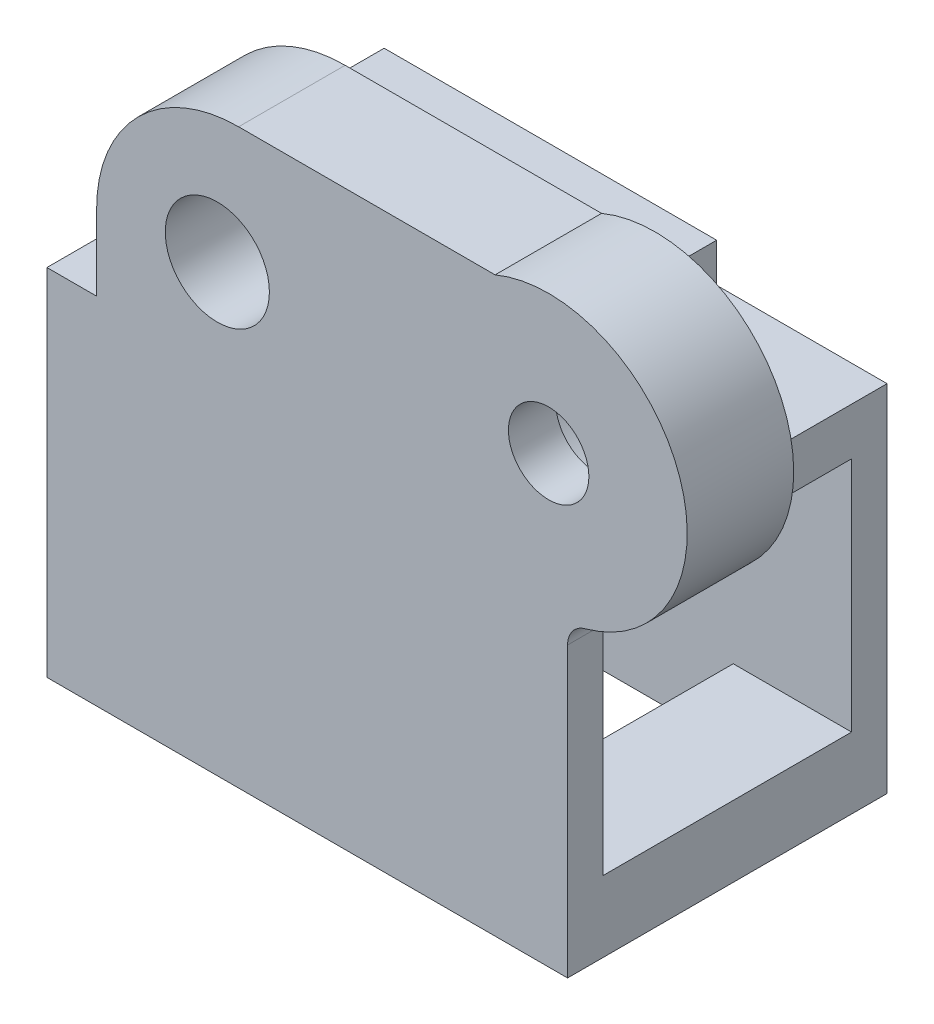
ISO-10303-21;
HEADER;
FILE_DESCRIPTION(('STEP AP214'),'2;1');
FILE_NAME('part.step','',(''),(''),'','','');
FILE_SCHEMA(('AUTOMOTIVE_DESIGN { 1 0 10303 214 1 1 1 1 }'));
ENDSEC;
DATA;
#1=APPLICATION_CONTEXT('core data for automotive mechanical design processes');
#2=APPLICATION_PROTOCOL_DEFINITION('international standard','automotive_design',2000,#1);
#3=PRODUCT_CONTEXT('',#1,'mechanical');
#4=PRODUCT('Part','Part','',(#3));
#5=PRODUCT_RELATED_PRODUCT_CATEGORY('part','',(#4));
#6=PRODUCT_DEFINITION_FORMATION('','',#4);
#7=PRODUCT_DEFINITION_CONTEXT('part definition',#1,'design');
#8=PRODUCT_DEFINITION('design','',#6,#7);
#9=PRODUCT_DEFINITION_SHAPE('','',#8);
#10=(LENGTH_UNIT() NAMED_UNIT(*) SI_UNIT(.MILLI.,.METRE.));
#11=(NAMED_UNIT(*) PLANE_ANGLE_UNIT() SI_UNIT($,.RADIAN.));
#12=(NAMED_UNIT(*) SI_UNIT($,.STERADIAN.) SOLID_ANGLE_UNIT());
#13=UNCERTAINTY_MEASURE_WITH_UNIT(LENGTH_MEASURE(1.E-05),#10,'distance_accuracy_value','');
#14=(GEOMETRIC_REPRESENTATION_CONTEXT(3) GLOBAL_UNCERTAINTY_ASSIGNED_CONTEXT((#13)) GLOBAL_UNIT_ASSIGNED_CONTEXT((#10,
#11,#12)) REPRESENTATION_CONTEXT('',''));
#15=CARTESIAN_POINT('',(0.,0.,0.));
#16=DIRECTION('',(0.,0.,1.));
#17=DIRECTION('',(1.,0.,0.));
#18=AXIS2_PLACEMENT_3D('',#15,#16,#17);
#19=CARTESIAN_POINT('',(0.,5.,0.));
#20=DIRECTION('',(0.,-1.,0.));
#21=DIRECTION('',(0.,0.,-1.));
#22=AXIS2_PLACEMENT_3D('',#19,#20,#21);
#23=PLANE('',#22);
#24=CARTESIAN_POINT('',(11.25,5.,-5.25));
#25=DIRECTION('',(0.,1.,0.));
#26=DIRECTION('',(0.,0.,1.));
#27=AXIS2_PLACEMENT_3D('',#24,#25,#26);
#28=CIRCLE('',#27,2.2);
#29=CARTESIAN_POINT('',(11.25,5.,-3.05));
#30=VERTEX_POINT('',#29);
#31=EDGE_CURVE('E262',#30,#30,#28,.T.);
#32=ORIENTED_EDGE('',*,*,#31,.F.);
#33=EDGE_LOOP('',(#32));
#34=FACE_BOUND('',#33,.T.);
#35=DIRECTION('',(0.,0.,1.));
#36=VECTOR('',#35,1.);
#37=CARTESIAN_POINT('',(2.6,5.,-10.65));
#38=LINE('',#37,#36);
#39=CARTESIAN_POINT('',(2.6,5.,-10.65));
#40=VERTEX_POINT('',#39);
#41=CARTESIAN_POINT('',(2.6,5.,-3.));
#42=VERTEX_POINT('',#41);
#43=EDGE_CURVE('E274',#40,#42,#38,.T.);
#44=ORIENTED_EDGE('',*,*,#43,.T.);
#45=DIRECTION('',(-1.,0.,0.));
#46=VECTOR('',#45,1.);
#47=CARTESIAN_POINT('',(0.,5.,-3.));
#48=LINE('',#47,#46);
#49=CARTESIAN_POINT('',(5.65060984680808,5.,-3.));
#50=VERTEX_POINT('',#49);
#51=EDGE_CURVE('E219',#50,#42,#48,.T.);
#52=ORIENTED_EDGE('',*,*,#51,.F.);
#53=DIRECTION('',(-1.,0.,0.));
#54=VECTOR('',#53,1.);
#55=CARTESIAN_POINT('',(0.,5.,-3.));
#56=LINE('',#55,#54);
#57=CARTESIAN_POINT('',(9.74939015319192,5.,-3.));
#58=VERTEX_POINT('',#57);
#59=EDGE_CURVE('E213',#58,#50,#56,.T.);
#60=ORIENTED_EDGE('',*,*,#59,.F.);
#61=CARTESIAN_POINT('',(16.65,5.,-3.));
#62=VERTEX_POINT('',#61);
#63=EDGE_CURVE('E217',#62,#58,#48,.T.);
#64=ORIENTED_EDGE('',*,*,#63,.F.);
#65=DIRECTION('',(0.,0.,-1.));
#66=VECTOR('',#65,1.);
#67=CARTESIAN_POINT('',(16.65,5.,0.15));
#68=LINE('',#67,#66);
#69=CARTESIAN_POINT('',(16.65,5.,-10.65));
#70=VERTEX_POINT('',#69);
#71=EDGE_CURVE('E267',#62,#70,#68,.T.);
#72=ORIENTED_EDGE('',*,*,#71,.T.);
#73=DIRECTION('',(-1.,0.,0.));
#74=VECTOR('',#73,1.);
#75=CARTESIAN_POINT('',(5.85,5.,-10.65));
#76=LINE('',#75,#74);
#77=EDGE_CURVE('E270',#70,#40,#76,.T.);
#78=ORIENTED_EDGE('',*,*,#77,.T.);
#79=EDGE_LOOP('',(#44,#52,#60,#64,#72,#78));
#80=FACE_BOUND('',#79,.T.);
#81=ADVANCED_FACE('F47',(#34,#80),#23,.F.);
#82=CARTESIAN_POINT('',(21.7,5.8,-3.));
#83=DIRECTION('',(0.,0.,1.));
#84=DIRECTION('',(1.,0.,0.));
#85=AXIS2_PLACEMENT_3D('',#82,#83,#84);
#86=CYLINDRICAL_SURFACE('',#85,5.85491246732178);
#87=CARTESIAN_POINT('',(21.7,5.8,-3.));
#88=DIRECTION('',(0.,0.,-1.));
#89=DIRECTION('',(-1.,0.,0.));
#90=AXIS2_PLACEMENT_3D('',#87,#88,#89);
#91=CIRCLE('',#90,5.85491246732178);
#92=CARTESIAN_POINT('',(19.4372583002031,11.2,-3.));
#93=VERTEX_POINT('',#92);
#94=CARTESIAN_POINT('',(22.5,0.,-3.));
#95=VERTEX_POINT('',#94);
#96=EDGE_CURVE('E345',#93,#95,#91,.T.);
#97=ORIENTED_EDGE('',*,*,#96,.F.);
#98=DIRECTION('',(0.,0.,1.));
#99=VECTOR('',#98,1.);
#100=CARTESIAN_POINT('',(19.437258300203,11.2,-3.));
#101=LINE('',#100,#99);
#102=CARTESIAN_POINT('',(19.4372583002031,11.2,1.5));
#103=VERTEX_POINT('',#102);
#104=EDGE_CURVE('E257',#93,#103,#101,.T.);
#105=ORIENTED_EDGE('',*,*,#104,.T.);
#106=CARTESIAN_POINT('',(21.7,5.8,1.5));
#107=DIRECTION('',(0.,0.,1.));
#108=DIRECTION('',(-1.,0.,0.));
#109=AXIS2_PLACEMENT_3D('',#106,#107,#108);
#110=CIRCLE('',#109,5.85491246732178);
#111=CARTESIAN_POINT('',(23.2374145901088,0.150543709513225,1.5));
#112=VERTEX_POINT('',#111);
#113=EDGE_CURVE('E325',#112,#103,#110,.T.);
#114=ORIENTED_EDGE('',*,*,#113,.F.);
#115=DIRECTION('',(0.,0.,1.));
#116=VECTOR('',#115,1.);
#117=CARTESIAN_POINT('',(23.2374145901088,0.150543709513225,-3.));
#118=LINE('',#117,#116);
#119=CARTESIAN_POINT('',(23.2374145901088,0.150543709513225,0.));
#120=VERTEX_POINT('',#119);
#121=EDGE_CURVE('E448',#112,#120,#118,.F.);
#122=ORIENTED_EDGE('',*,*,#121,.T.);
#123=CARTESIAN_POINT('',(21.7,5.8,0.));
#124=DIRECTION('',(0.,0.,1.));
#125=DIRECTION('',(1.,0.,0.));
#126=AXIS2_PLACEMENT_3D('',#123,#124,#125);
#127=CIRCLE('',#126,5.85491246732178);
#128=CARTESIAN_POINT('',(22.5,0.,0.));
#129=VERTEX_POINT('',#128);
#130=EDGE_CURVE('E444',#120,#129,#127,.F.);
#131=ORIENTED_EDGE('',*,*,#130,.T.);
#132=DIRECTION('',(0.,0.,1.));
#133=VECTOR('',#132,1.);
#134=CARTESIAN_POINT('',(22.5,0.,-12.002));
#135=LINE('',#134,#133);
#136=EDGE_CURVE('E391',#95,#129,#135,.T.);
#137=ORIENTED_EDGE('',*,*,#136,.F.);
#138=EDGE_LOOP('',(#97,#105,#114,#122,#131,#137));
#139=FACE_BOUND('',#138,.T.);
#140=ADVANCED_FACE('F481',(#139),#86,.T.);
#141=CARTESIAN_POINT('',(0.,0.,-3.));
#142=DIRECTION('',(0.,0.,-1.));
#143=DIRECTION('',(-1.,0.,0.));
#144=AXIS2_PLACEMENT_3D('',#141,#142,#143);
#145=PLANE('',#144);
#146=DIRECTION('',(0.,-1.,0.));
#147=VECTOR('',#146,1.);
#148=CARTESIAN_POINT('',(2.6,5.,-3.));
#149=LINE('',#148,#147);
#150=CARTESIAN_POINT('',(2.6,5.2,-3.));
#151=VERTEX_POINT('',#150);
#152=EDGE_CURVE('E254',#151,#42,#149,.T.);
#153=ORIENTED_EDGE('',*,*,#152,.F.);
#154=CARTESIAN_POINT('',(8.6,5.2,-3.));
#155=DIRECTION('',(0.,0.,-1.));
#156=DIRECTION('',(-1.,0.,0.));
#157=AXIS2_PLACEMENT_3D('',#154,#155,#156);
#158=CIRCLE('',#157,6.);
#159=CARTESIAN_POINT('',(8.6,11.2,-3.));
#160=VERTEX_POINT('',#159);
#161=EDGE_CURVE('E11',#151,#160,#158,.T.);
#162=ORIENTED_EDGE('',*,*,#161,.T.);
#163=DIRECTION('',(-1.,0.,0.));
#164=VECTOR('',#163,1.);
#165=CARTESIAN_POINT('',(2.6,11.2,-3.));
#166=LINE('',#165,#164);
#167=EDGE_CURVE('E250',#93,#160,#166,.T.);
#168=ORIENTED_EDGE('',*,*,#167,.F.);
#169=ORIENTED_EDGE('',*,*,#96,.T.);
#170=DIRECTION('',(0.,1.,0.));
#171=VECTOR('',#170,1.);
#172=CARTESIAN_POINT('',(22.5,0.,-3.));
#173=LINE('',#172,#171);
#174=CARTESIAN_POINT('',(22.5,2.,-3.));
#175=VERTEX_POINT('',#174);
#176=EDGE_CURVE('E348',#95,#175,#173,.T.);
#177=ORIENTED_EDGE('',*,*,#176,.T.);
#178=DIRECTION('',(-1.,0.,0.));
#179=VECTOR('',#178,1.);
#180=CARTESIAN_POINT('',(0.,2.,-3.));
#181=LINE('',#180,#179);
#182=CARTESIAN_POINT('',(22.5774964387392,2.,-3.));
#183=VERTEX_POINT('',#182);
#184=EDGE_CURVE('E333',#183,#175,#181,.T.);
#185=ORIENTED_EDGE('',*,*,#184,.F.);
#186=CARTESIAN_POINT('',(21.7,5.8,-3.));
#187=DIRECTION('',(0.,0.,-1.));
#188=DIRECTION('',(-1.,0.,0.));
#189=AXIS2_PLACEMENT_3D('',#186,#187,#188);
#190=CIRCLE('',#189,3.9);
#191=CARTESIAN_POINT('',(20.8225035612608,2.,-3.));
#192=VERTEX_POINT('',#191);
#193=EDGE_CURVE('E337',#183,#192,#190,.F.);
#194=ORIENTED_EDGE('',*,*,#193,.T.);
#195=DIRECTION('',(-1.,0.,0.));
#196=VECTOR('',#195,1.);
#197=CARTESIAN_POINT('',(0.,2.,-3.));
#198=LINE('',#197,#196);
#199=CARTESIAN_POINT('',(16.65,2.,-3.));
#200=VERTEX_POINT('',#199);
#201=EDGE_CURVE('E342',#192,#200,#198,.T.);
#202=ORIENTED_EDGE('',*,*,#201,.T.);
#203=DIRECTION('',(0.,1.,0.));
#204=VECTOR('',#203,1.);
#205=CARTESIAN_POINT('',(16.65,0.,-3.));
#206=LINE('',#205,#204);
#207=EDGE_CURVE('E226',#200,#62,#206,.T.);
#208=ORIENTED_EDGE('',*,*,#207,.T.);
#209=ORIENTED_EDGE('',*,*,#63,.T.);
#210=CARTESIAN_POINT('',(7.7,5.8,-3.));
#211=DIRECTION('',(0.,0.,1.));
#212=DIRECTION('',(1.,0.,0.));
#213=AXIS2_PLACEMENT_3D('',#210,#211,#212);
#214=CIRCLE('',#213,2.2);
#215=EDGE_CURVE('E197',#58,#50,#214,.T.);
#216=ORIENTED_EDGE('',*,*,#215,.T.);
#217=ORIENTED_EDGE('',*,*,#51,.T.);
#218=EDGE_LOOP('',(#153,#162,#168,#169,#177,#185,#194,#202,#208,#209,#216,#217));
#219=FACE_BOUND('',#218,.T.);
#220=ADVANCED_FACE('F224',(#219),#145,.T.);
#221=CARTESIAN_POINT('',(0.,-13.,-10.5));
#222=DIRECTION('',(0.,0.,1.));
#223=DIRECTION('',(1.,0.,0.));
#224=AXIS2_PLACEMENT_3D('',#221,#222,#223);
#225=PLANE('',#224);
#226=DIRECTION('',(0.,1.,0.));
#227=VECTOR('',#226,1.);
#228=CARTESIAN_POINT('',(0.5,0.,-10.5));
#229=LINE('',#228,#227);
#230=CARTESIAN_POINT('',(0.5,-13.,-10.5));
#231=VERTEX_POINT('',#230);
#232=CARTESIAN_POINT('',(0.5,0.,-10.5));
#233=VERTEX_POINT('',#232);
#234=EDGE_CURVE('E299',#231,#233,#229,.T.);
#235=ORIENTED_EDGE('',*,*,#234,.F.);
#236=DIRECTION('',(1.,0.,0.));
#237=VECTOR('',#236,1.);
#238=CARTESIAN_POINT('',(0.,-13.,-10.5));
#239=LINE('',#238,#237);
#240=CARTESIAN_POINT('',(17.5,-13.,-10.5));
#241=VERTEX_POINT('',#240);
#242=EDGE_CURVE('E407',#231,#241,#239,.T.);
#243=ORIENTED_EDGE('',*,*,#242,.T.);
#244=DIRECTION('',(0.,-1.,0.));
#245=VECTOR('',#244,1.);
#246=CARTESIAN_POINT('',(17.5,-10.,-10.5));
#247=LINE('',#246,#245);
#248=CARTESIAN_POINT('',(17.5,-10.,-10.5));
#249=VERTEX_POINT('',#248);
#250=EDGE_CURVE('E377',#249,#241,#247,.T.);
#251=ORIENTED_EDGE('',*,*,#250,.F.);
#252=DIRECTION('',(1.,0.,0.));
#253=VECTOR('',#252,1.);
#254=CARTESIAN_POINT('',(17.5,-10.,-10.5));
#255=LINE('',#254,#253);
#256=CARTESIAN_POINT('',(22.5,-10.,-10.5));
#257=VERTEX_POINT('',#256);
#258=EDGE_CURVE('E370',#249,#257,#255,.T.);
#259=ORIENTED_EDGE('',*,*,#258,.T.);
#260=DIRECTION('',(0.,1.,0.));
#261=VECTOR('',#260,1.);
#262=CARTESIAN_POINT('',(22.5,-13.,-10.5));
#263=LINE('',#262,#261);
#264=CARTESIAN_POINT('',(22.5,0.,-10.5));
#265=VERTEX_POINT('',#264);
#266=EDGE_CURVE('E428',#257,#265,#263,.T.);
#267=ORIENTED_EDGE('',*,*,#266,.T.);
#268=DIRECTION('',(-1.,0.,0.));
#269=VECTOR('',#268,1.);
#270=CARTESIAN_POINT('',(0.,0.,-10.5));
#271=LINE('',#270,#269);
#272=EDGE_CURVE('E440',#265,#233,#271,.T.);
#273=ORIENTED_EDGE('',*,*,#272,.T.);
#274=EDGE_LOOP('',(#235,#243,#251,#259,#267,#273));
#275=FACE_BOUND('',#274,.T.);
#276=ADVANCED_FACE('F534',(#275),#225,.T.);
#277=CARTESIAN_POINT('',(0.,-13.,0.));
#278=DIRECTION('',(0.,0.,1.));
#279=DIRECTION('',(1.,0.,0.));
#280=AXIS2_PLACEMENT_3D('',#277,#278,#279);
#281=PLANE('',#280);
#282=DIRECTION('',(1.,0.,0.));
#283=VECTOR('',#282,1.);
#284=CARTESIAN_POINT('',(0.,-13.,0.));
#285=LINE('',#284,#283);
#286=CARTESIAN_POINT('',(0.500000000000001,-13.,0.));
#287=VERTEX_POINT('',#286);
#288=CARTESIAN_POINT('',(17.5,-13.,0.));
#289=VERTEX_POINT('',#288);
#290=EDGE_CURVE('E404',#287,#289,#285,.T.);
#291=ORIENTED_EDGE('',*,*,#290,.F.);
#292=DIRECTION('',(0.,-1.,0.));
#293=VECTOR('',#292,1.);
#294=CARTESIAN_POINT('',(0.500000000000001,-13.,0.));
#295=LINE('',#294,#293);
#296=CARTESIAN_POINT('',(0.500000000000001,0.,0.));
#297=VERTEX_POINT('',#296);
#298=EDGE_CURVE('E305',#297,#287,#295,.T.);
#299=ORIENTED_EDGE('',*,*,#298,.F.);
#300=DIRECTION('',(1.,0.,0.));
#301=VECTOR('',#300,1.);
#302=CARTESIAN_POINT('',(0.,0.,0.));
#303=LINE('',#302,#301);
#304=EDGE_CURVE('E427',#297,#129,#303,.T.);
#305=ORIENTED_EDGE('',*,*,#304,.T.);
#306=ORIENTED_EDGE('',*,*,#130,.F.);
#307=CARTESIAN_POINT('',(23.5,-0.814365043951199,0.));
#308=DIRECTION('',(0.,0.,1.));
#309=DIRECTION('',(1.,0.,0.));
#310=AXIS2_PLACEMENT_3D('',#307,#308,#309);
#311=CIRCLE('',#310,1.);
#312=CARTESIAN_POINT('',(22.5,-0.814365043951199,0.));
#313=VERTEX_POINT('',#312);
#314=EDGE_CURVE('E458',#120,#313,#311,.T.);
#315=ORIENTED_EDGE('',*,*,#314,.T.);
#316=DIRECTION('',(0.,1.,0.));
#317=VECTOR('',#316,1.);
#318=CARTESIAN_POINT('',(22.5,-13.,0.));
#319=LINE('',#318,#317);
#320=CARTESIAN_POINT('',(22.5,-10.,0.));
#321=VERTEX_POINT('',#320);
#322=EDGE_CURVE('E431',#321,#313,#319,.T.);
#323=ORIENTED_EDGE('',*,*,#322,.F.);
#324=DIRECTION('',(1.,0.,0.));
#325=VECTOR('',#324,1.);
#326=CARTESIAN_POINT('',(0.,-10.,0.));
#327=LINE('',#326,#325);
#328=CARTESIAN_POINT('',(17.5,-10.,0.));
#329=VERTEX_POINT('',#328);
#330=EDGE_CURVE('E388',#329,#321,#327,.T.);
#331=ORIENTED_EDGE('',*,*,#330,.F.);
#332=DIRECTION('',(0.,-1.,0.));
#333=VECTOR('',#332,1.);
#334=CARTESIAN_POINT('',(17.5,-13.,0.));
#335=LINE('',#334,#333);
#336=EDGE_CURVE('E384',#329,#289,#335,.T.);
#337=ORIENTED_EDGE('',*,*,#336,.T.);
#338=EDGE_LOOP('',(#291,#299,#305,#306,#315,#323,#331,#337));
#339=FACE_BOUND('',#338,.T.);
#340=ADVANCED_FACE('F465',(#339),#281,.F.);
#341=CARTESIAN_POINT('',(0.,2.,0.));
#342=DIRECTION('',(0.,-1.,0.));
#343=DIRECTION('',(0.,0.,-1.));
#344=AXIS2_PLACEMENT_3D('',#341,#342,#343);
#345=PLANE('',#344);
#346=DIRECTION('',(0.,0.,1.));
#347=VECTOR('',#346,1.);
#348=CARTESIAN_POINT('',(2.6,2.,-10.65));
#349=LINE('',#348,#347);
#350=CARTESIAN_POINT('',(2.6,2.,-10.65));
#351=VERTEX_POINT('',#350);
#352=CARTESIAN_POINT('',(2.6,2.,1.5));
#353=VERTEX_POINT('',#352);
#354=EDGE_CURVE('E280',#351,#353,#349,.T.);
#355=ORIENTED_EDGE('',*,*,#354,.F.);
#356=DIRECTION('',(-1.,0.,0.));
#357=VECTOR('',#356,1.);
#358=CARTESIAN_POINT('',(5.85,2.,-10.65));
#359=LINE('',#358,#357);
#360=CARTESIAN_POINT('',(16.65,2.,-10.65));
#361=VERTEX_POINT('',#360);
#362=EDGE_CURVE('E266',#361,#351,#359,.T.);
#363=ORIENTED_EDGE('',*,*,#362,.F.);
#364=DIRECTION('',(0.,0.,-1.));
#365=VECTOR('',#364,1.);
#366=CARTESIAN_POINT('',(16.65,2.,1.5));
#367=LINE('',#366,#365);
#368=EDGE_CURVE('E271',#200,#361,#367,.T.);
#369=ORIENTED_EDGE('',*,*,#368,.F.);
#370=ORIENTED_EDGE('',*,*,#201,.F.);
#371=DIRECTION('',(0.,0.,1.));
#372=VECTOR('',#371,1.);
#373=CARTESIAN_POINT('',(20.8225035612608,2.,-3.));
#374=LINE('',#373,#372);
#375=CARTESIAN_POINT('',(20.8225035612608,2.,-0.5));
#376=VERTEX_POINT('',#375);
#377=EDGE_CURVE('E352',#192,#376,#374,.T.);
#378=ORIENTED_EDGE('',*,*,#377,.T.);
#379=DIRECTION('',(-1.,0.,0.));
#380=VECTOR('',#379,1.);
#381=CARTESIAN_POINT('',(0.,2.,-0.5));
#382=LINE('',#381,#380);
#383=CARTESIAN_POINT('',(22.5774964387392,2.,-0.5));
#384=VERTEX_POINT('',#383);
#385=EDGE_CURVE('E332',#384,#376,#382,.T.);
#386=ORIENTED_EDGE('',*,*,#385,.F.);
#387=DIRECTION('',(0.,0.,1.));
#388=VECTOR('',#387,1.);
#389=CARTESIAN_POINT('',(22.5774964387392,2.,-3.));
#390=LINE('',#389,#388);
#391=EDGE_CURVE('E361',#183,#384,#390,.T.);
#392=ORIENTED_EDGE('',*,*,#391,.F.);
#393=ORIENTED_EDGE('',*,*,#184,.T.);
#394=DIRECTION('',(0.,0.,1.));
#395=VECTOR('',#394,1.);
#396=CARTESIAN_POINT('',(22.5,2.,0.));
#397=LINE('',#396,#395);
#398=CARTESIAN_POINT('',(22.5,2.,-12.));
#399=VERTEX_POINT('',#398);
#400=EDGE_CURVE('E401',#399,#175,#397,.T.);
#401=ORIENTED_EDGE('',*,*,#400,.F.);
#402=DIRECTION('',(1.,0.,0.));
#403=VECTOR('',#402,1.);
#404=CARTESIAN_POINT('',(0.,2.,-12.));
#405=LINE('',#404,#403);
#406=CARTESIAN_POINT('',(0.5,2.,-12.));
#407=VERTEX_POINT('',#406);
#408=EDGE_CURVE('E396',#407,#399,#405,.T.);
#409=ORIENTED_EDGE('',*,*,#408,.F.);
#410=DIRECTION('',(0.,0.,-1.));
#411=VECTOR('',#410,1.);
#412=CARTESIAN_POINT('',(0.5,2.,-12.));
#413=LINE('',#412,#411);
#414=CARTESIAN_POINT('',(0.500000000000002,2.,1.5));
#415=VERTEX_POINT('',#414);
#416=EDGE_CURVE('E314',#415,#407,#413,.T.);
#417=ORIENTED_EDGE('',*,*,#416,.F.);
#418=DIRECTION('',(1.,0.,0.));
#419=VECTOR('',#418,1.);
#420=CARTESIAN_POINT('',(0.,2.,1.5));
#421=LINE('',#420,#419);
#422=EDGE_CURVE('E417',#415,#353,#421,.T.);
#423=ORIENTED_EDGE('',*,*,#422,.T.);
#424=EDGE_LOOP('',(#355,#363,#369,#370,#378,#386,#392,#393,#401,#409,#417,#423));
#425=FACE_BOUND('',#424,.T.);
#426=ADVANCED_FACE('F559',(#425),#345,.F.);
#427=CARTESIAN_POINT('',(0.,0.,0.));
#428=DIRECTION('',(0.,-1.,0.));
#429=DIRECTION('',(0.,0.,-1.));
#430=AXIS2_PLACEMENT_3D('',#427,#428,#429);
#431=PLANE('',#430);
#432=CARTESIAN_POINT('',(11.25,0.,-5.25));
#433=DIRECTION('',(0.,-1.,0.));
#434=DIRECTION('',(0.,0.,-1.));
#435=AXIS2_PLACEMENT_3D('',#432,#433,#434);
#436=CIRCLE('',#435,2.2);
#437=CARTESIAN_POINT('',(11.25,0.,-7.45));
#438=VERTEX_POINT('',#437);
#439=EDGE_CURVE('E237',#438,#438,#436,.T.);
#440=ORIENTED_EDGE('',*,*,#439,.F.);
#441=EDGE_LOOP('',(#440));
#442=FACE_BOUND('',#441,.T.);
#443=DIRECTION('',(0.,0.,1.));
#444=VECTOR('',#443,1.);
#445=CARTESIAN_POINT('',(0.500000000000001,0.,0.));
#446=LINE('',#445,#444);
#447=EDGE_CURVE('E302',#233,#297,#446,.T.);
#448=ORIENTED_EDGE('',*,*,#447,.F.);
#449=ORIENTED_EDGE('',*,*,#272,.F.);
#450=EDGE_CURVE('E392',#265,#95,#135,.T.);
#451=ORIENTED_EDGE('',*,*,#450,.T.);
#452=ORIENTED_EDGE('',*,*,#136,.T.);
#453=ORIENTED_EDGE('',*,*,#304,.F.);
#454=EDGE_LOOP('',(#448,#449,#451,#452,#453));
#455=FACE_BOUND('',#454,.T.);
#456=ADVANCED_FACE('F565',(#442,#455),#431,.T.);
#457=CARTESIAN_POINT('',(0.,-13.,-12.));
#458=DIRECTION('',(0.,0.,1.));
#459=DIRECTION('',(1.,0.,0.));
#460=AXIS2_PLACEMENT_3D('',#457,#458,#459);
#461=PLANE('',#460);
#462=DIRECTION('',(1.,0.,0.));
#463=VECTOR('',#462,1.);
#464=CARTESIAN_POINT('',(0.,-13.,-12.));
#465=LINE('',#464,#463);
#466=CARTESIAN_POINT('',(0.500000000000001,-13.,-12.));
#467=VERTEX_POINT('',#466);
#468=CARTESIAN_POINT('',(22.5,-13.,-12.));
#469=VERTEX_POINT('',#468);
#470=EDGE_CURVE('E397',#467,#469,#465,.T.);
#471=ORIENTED_EDGE('',*,*,#470,.F.);
#472=DIRECTION('',(0.,-1.,0.));
#473=VECTOR('',#472,1.);
#474=CARTESIAN_POINT('',(0.5,-13.,-12.));
#475=LINE('',#474,#473);
#476=EDGE_CURVE('E317',#407,#467,#475,.T.);
#477=ORIENTED_EDGE('',*,*,#476,.F.);
#478=ORIENTED_EDGE('',*,*,#408,.T.);
#479=DIRECTION('',(0.,1.,0.));
#480=VECTOR('',#479,1.);
#481=CARTESIAN_POINT('',(22.5,-13.,-12.));
#482=LINE('',#481,#480);
#483=EDGE_CURVE('E423',#469,#399,#482,.T.);
#484=ORIENTED_EDGE('',*,*,#483,.F.);
#485=EDGE_LOOP('',(#471,#477,#478,#484));
#486=FACE_BOUND('',#485,.T.);
#487=ADVANCED_FACE('F553',(#486),#461,.F.);
#488=CARTESIAN_POINT('',(22.5,-13.,0.));
#489=DIRECTION('',(-1.,0.,0.));
#490=DIRECTION('',(0.,0.,1.));
#491=AXIS2_PLACEMENT_3D('',#488,#489,#490);
#492=PLANE('',#491);
#493=ORIENTED_EDGE('',*,*,#322,.T.);
#494=DIRECTION('',(0.,0.,-1.));
#495=VECTOR('',#494,1.);
#496=CARTESIAN_POINT('',(22.5,-0.814365043951199,1.5));
#497=LINE('',#496,#495);
#498=CARTESIAN_POINT('',(22.5,-0.814365043951199,1.5));
#499=VERTEX_POINT('',#498);
#500=EDGE_CURVE('E452',#313,#499,#497,.F.);
#501=ORIENTED_EDGE('',*,*,#500,.T.);
#502=DIRECTION('',(0.,1.,0.));
#503=VECTOR('',#502,1.);
#504=CARTESIAN_POINT('',(22.5,-13.,1.5));
#505=LINE('',#504,#503);
#506=CARTESIAN_POINT('',(22.5,-13.,1.5));
#507=VERTEX_POINT('',#506);
#508=EDGE_CURVE('E414',#507,#499,#505,.T.);
#509=ORIENTED_EDGE('',*,*,#508,.F.);
#510=DIRECTION('',(0.,0.,1.));
#511=VECTOR('',#510,1.);
#512=CARTESIAN_POINT('',(22.5,-13.,0.));
#513=LINE('',#512,#511);
#514=EDGE_CURVE('E410',#469,#507,#513,.T.);
#515=ORIENTED_EDGE('',*,*,#514,.F.);
#516=ORIENTED_EDGE('',*,*,#483,.T.);
#517=ORIENTED_EDGE('',*,*,#400,.T.);
#518=ORIENTED_EDGE('',*,*,#176,.F.);
#519=ORIENTED_EDGE('',*,*,#450,.F.);
#520=ORIENTED_EDGE('',*,*,#266,.F.);
#521=DIRECTION('',(0.,0.,1.));
#522=VECTOR('',#521,1.);
#523=CARTESIAN_POINT('',(22.5,-10.,-10.5));
#524=LINE('',#523,#522);
#525=EDGE_CURVE('E373',#257,#321,#524,.T.);
#526=ORIENTED_EDGE('',*,*,#525,.T.);
#527=EDGE_LOOP('',(#493,#501,#509,#515,#516,#517,#518,#519,#520,#526));
#528=FACE_BOUND('',#527,.T.);
#529=ADVANCED_FACE('F471',(#528),#492,.F.);
#530=CARTESIAN_POINT('',(0.,-13.,1.5));
#531=DIRECTION('',(0.,0.,1.));
#532=DIRECTION('',(1.,0.,0.));
#533=AXIS2_PLACEMENT_3D('',#530,#531,#532);
#534=PLANE('',#533);
#535=CARTESIAN_POINT('',(7.7,5.8,1.5));
#536=DIRECTION('',(0.,0.,1.));
#537=DIRECTION('',(1.,0.,0.));
#538=AXIS2_PLACEMENT_3D('',#535,#536,#537);
#539=CIRCLE('',#538,2.2);
#540=CARTESIAN_POINT('',(9.9,5.8,1.5));
#541=VERTEX_POINT('',#540);
#542=EDGE_CURVE('E208',#541,#541,#539,.T.);
#543=ORIENTED_EDGE('',*,*,#542,.F.);
#544=EDGE_LOOP('',(#543));
#545=FACE_BOUND('',#544,.T.);
#546=DIRECTION('',(-1.,0.,0.));
#547=VECTOR('',#546,1.);
#548=CARTESIAN_POINT('',(2.6,11.2,1.5));
#549=LINE('',#548,#547);
#550=CARTESIAN_POINT('',(8.6,11.2,1.5));
#551=VERTEX_POINT('',#550);
#552=EDGE_CURVE('E221',#103,#551,#549,.T.);
#553=ORIENTED_EDGE('',*,*,#552,.T.);
#554=CARTESIAN_POINT('',(8.6,5.2,1.5));
#555=DIRECTION('',(0.,0.,1.));
#556=DIRECTION('',(1.,0.,0.));
#557=AXIS2_PLACEMENT_3D('',#554,#555,#556);
#558=CIRCLE('',#557,6.);
#559=CARTESIAN_POINT('',(2.6,5.2,1.5));
#560=VERTEX_POINT('',#559);
#561=EDGE_CURVE('E70',#551,#560,#558,.T.);
#562=ORIENTED_EDGE('',*,*,#561,.T.);
#563=DIRECTION('',(0.,-1.,0.));
#564=VECTOR('',#563,1.);
#565=CARTESIAN_POINT('',(2.6,5.,1.5));
#566=LINE('',#565,#564);
#567=EDGE_CURVE('E277',#560,#353,#566,.T.);
#568=ORIENTED_EDGE('',*,*,#567,.T.);
#569=ORIENTED_EDGE('',*,*,#422,.F.);
#570=DIRECTION('',(0.,1.,0.));
#571=VECTOR('',#570,1.);
#572=CARTESIAN_POINT('',(0.500000000000002,2.,1.5));
#573=LINE('',#572,#571);
#574=CARTESIAN_POINT('',(0.500000000000002,-13.,1.5));
#575=VERTEX_POINT('',#574);
#576=EDGE_CURVE('E311',#575,#415,#573,.T.);
#577=ORIENTED_EDGE('',*,*,#576,.F.);
#578=DIRECTION('',(1.,0.,0.));
#579=VECTOR('',#578,1.);
#580=CARTESIAN_POINT('',(0.,-13.,1.5));
#581=LINE('',#580,#579);
#582=EDGE_CURVE('E400',#575,#507,#581,.T.);
#583=ORIENTED_EDGE('',*,*,#582,.T.);
#584=ORIENTED_EDGE('',*,*,#508,.T.);
#585=CARTESIAN_POINT('',(23.5,-0.814365043951199,1.5));
#586=DIRECTION('',(0.,0.,1.));
#587=DIRECTION('',(1.,0.,0.));
#588=AXIS2_PLACEMENT_3D('',#585,#586,#587);
#589=CIRCLE('',#588,1.);
#590=EDGE_CURVE('E456',#499,#112,#589,.F.);
#591=ORIENTED_EDGE('',*,*,#590,.T.);
#592=ORIENTED_EDGE('',*,*,#113,.T.);
#593=EDGE_LOOP('',(#553,#562,#568,#569,#577,#583,#584,#591,#592));
#594=FACE_BOUND('',#593,.T.);
#595=CARTESIAN_POINT('',(21.7,5.8,1.5));
#596=DIRECTION('',(0.,0.,1.));
#597=DIRECTION('',(1.,0.,0.));
#598=AXIS2_PLACEMENT_3D('',#595,#596,#597);
#599=CIRCLE('',#598,1.7);
#600=CARTESIAN_POINT('',(23.4,5.8,1.5));
#601=VERTEX_POINT('',#600);
#602=EDGE_CURVE('E320',#601,#601,#599,.T.);
#603=ORIENTED_EDGE('',*,*,#602,.F.);
#604=EDGE_LOOP('',(#603));
#605=FACE_BOUND('',#604,.T.);
#606=ADVANCED_FACE('F477',(#545,#594,#605),#534,.T.);
#607=CARTESIAN_POINT('',(0.,-13.,0.));
#608=DIRECTION('',(0.,1.,0.));
#609=DIRECTION('',(0.,0.,1.));
#610=AXIS2_PLACEMENT_3D('',#607,#608,#609);
#611=PLANE('',#610);
#612=ORIENTED_EDGE('',*,*,#582,.F.);
#613=DIRECTION('',(0.,0.,1.));
#614=VECTOR('',#613,1.);
#615=CARTESIAN_POINT('',(0.500000000000002,-13.,1.5));
#616=LINE('',#615,#614);
#617=EDGE_CURVE('E308',#287,#575,#616,.T.);
#618=ORIENTED_EDGE('',*,*,#617,.F.);
#619=ORIENTED_EDGE('',*,*,#290,.T.);
#620=DIRECTION('',(0.,0.,-1.));
#621=VECTOR('',#620,1.);
#622=CARTESIAN_POINT('',(17.5,-13.,0.));
#623=LINE('',#622,#621);
#624=EDGE_CURVE('E365',#289,#241,#623,.T.);
#625=ORIENTED_EDGE('',*,*,#624,.T.);
#626=ORIENTED_EDGE('',*,*,#242,.F.);
#627=DIRECTION('',(0.,0.,1.));
#628=VECTOR('',#627,1.);
#629=CARTESIAN_POINT('',(0.5,-13.,-10.5));
#630=LINE('',#629,#628);
#631=EDGE_CURVE('E296',#467,#231,#630,.T.);
#632=ORIENTED_EDGE('',*,*,#631,.F.);
#633=ORIENTED_EDGE('',*,*,#470,.T.);
#634=ORIENTED_EDGE('',*,*,#514,.T.);
#635=EDGE_LOOP('',(#612,#618,#619,#625,#626,#632,#633,#634));
#636=FACE_BOUND('',#635,.T.);
#637=ADVANCED_FACE('F543',(#636),#611,.F.);
#638=CARTESIAN_POINT('',(0.,-10.,0.));
#639=DIRECTION('',(0.,-1.,0.));
#640=DIRECTION('',(0.,0.,-1.));
#641=AXIS2_PLACEMENT_3D('',#638,#639,#640);
#642=PLANE('',#641);
#643=DIRECTION('',(0.,0.,-1.));
#644=VECTOR('',#643,1.);
#645=CARTESIAN_POINT('',(17.5,-10.,1.5));
#646=LINE('',#645,#644);
#647=EDGE_CURVE('E366',#329,#249,#646,.T.);
#648=ORIENTED_EDGE('',*,*,#647,.F.);
#649=ORIENTED_EDGE('',*,*,#330,.T.);
#650=ORIENTED_EDGE('',*,*,#525,.F.);
#651=ORIENTED_EDGE('',*,*,#258,.F.);
#652=EDGE_LOOP('',(#648,#649,#650,#651));
#653=FACE_BOUND('',#652,.T.);
#654=ADVANCED_FACE('F540',(#653),#642,.F.);
#655=CARTESIAN_POINT('',(17.5,-10.,0.));
#656=DIRECTION('',(-1.,0.,0.));
#657=DIRECTION('',(0.,0.,1.));
#658=AXIS2_PLACEMENT_3D('',#655,#656,#657);
#659=PLANE('',#658);
#660=ORIENTED_EDGE('',*,*,#336,.F.);
#661=ORIENTED_EDGE('',*,*,#647,.T.);
#662=ORIENTED_EDGE('',*,*,#250,.T.);
#663=ORIENTED_EDGE('',*,*,#624,.F.);
#664=EDGE_LOOP('',(#660,#661,#662,#663));
#665=FACE_BOUND('',#664,.T.);
#666=ADVANCED_FACE('F538',(#665),#659,.T.);
#667=CARTESIAN_POINT('',(21.7,5.8,-3.));
#668=DIRECTION('',(0.,0.,1.));
#669=DIRECTION('',(1.,0.,0.));
#670=AXIS2_PLACEMENT_3D('',#667,#668,#669);
#671=CYLINDRICAL_SURFACE('',#670,3.9);
#672=CARTESIAN_POINT('',(21.7,5.8,-0.5));
#673=DIRECTION('',(0.,0.,-1.));
#674=DIRECTION('',(-1.,0.,0.));
#675=AXIS2_PLACEMENT_3D('',#672,#673,#674);
#676=CIRCLE('',#675,3.9);
#677=EDGE_CURVE('E338',#384,#376,#676,.F.);
#678=ORIENTED_EDGE('',*,*,#677,.T.);
#679=ORIENTED_EDGE('',*,*,#377,.F.);
#680=ORIENTED_EDGE('',*,*,#193,.F.);
#681=ORIENTED_EDGE('',*,*,#391,.T.);
#682=EDGE_LOOP('',(#678,#679,#680,#681));
#683=FACE_BOUND('',#682,.T.);
#684=ADVANCED_FACE('F531',(#683),#671,.F.);
#685=CARTESIAN_POINT('',(21.7,5.8,-0.5));
#686=DIRECTION('',(0.,0.,-1.));
#687=DIRECTION('',(-1.,0.,0.));
#688=AXIS2_PLACEMENT_3D('',#685,#686,#687);
#689=PLANE('',#688);
#690=CARTESIAN_POINT('',(21.7,5.8,-0.5));
#691=DIRECTION('',(0.,0.,1.));
#692=DIRECTION('',(1.,0.,0.));
#693=AXIS2_PLACEMENT_3D('',#690,#691,#692);
#694=CIRCLE('',#693,1.7);
#695=CARTESIAN_POINT('',(23.4,5.8,-0.5));
#696=VERTEX_POINT('',#695);
#697=EDGE_CURVE('E321',#696,#696,#694,.T.);
#698=ORIENTED_EDGE('',*,*,#697,.T.);
#699=EDGE_LOOP('',(#698));
#700=FACE_BOUND('',#699,.T.);
#701=ORIENTED_EDGE('',*,*,#385,.T.);
#702=ORIENTED_EDGE('',*,*,#677,.F.);
#703=EDGE_LOOP('',(#701,#702));
#704=FACE_BOUND('',#703,.T.);
#705=ADVANCED_FACE('F527',(#700,#704),#689,.T.);
#706=CARTESIAN_POINT('',(21.7,5.8,-0.5));
#707=DIRECTION('',(0.,0.,1.));
#708=DIRECTION('',(1.,0.,0.));
#709=AXIS2_PLACEMENT_3D('',#706,#707,#708);
#710=CYLINDRICAL_SURFACE('',#709,1.7);
#711=ORIENTED_EDGE('',*,*,#697,.F.);
#712=EDGE_LOOP('',(#711));
#713=FACE_BOUND('',#712,.T.);
#714=ORIENTED_EDGE('',*,*,#602,.T.);
#715=EDGE_LOOP('',(#714));
#716=FACE_BOUND('',#715,.T.);
#717=ADVANCED_FACE('F524',(#713,#716),#710,.F.);
#718=CARTESIAN_POINT('',(23.5,-0.814365043951199,-3.));
#719=DIRECTION('',(0.,0.,1.));
#720=DIRECTION('',(1.,0.,0.));
#721=AXIS2_PLACEMENT_3D('',#718,#719,#720);
#722=CYLINDRICAL_SURFACE('',#721,1.);
#723=ORIENTED_EDGE('',*,*,#314,.F.);
#724=ORIENTED_EDGE('',*,*,#121,.F.);
#725=ORIENTED_EDGE('',*,*,#590,.F.);
#726=ORIENTED_EDGE('',*,*,#500,.F.);
#727=EDGE_LOOP('',(#723,#724,#725,#726));
#728=FACE_BOUND('',#727,.T.);
#729=ADVANCED_FACE('F475',(#728),#722,.F.);
#730=CARTESIAN_POINT('',(0.500000000000002,0.,0.));
#731=DIRECTION('',(1.,0.,0.));
#732=DIRECTION('',(0.,0.,-1.));
#733=AXIS2_PLACEMENT_3D('',#730,#731,#732);
#734=PLANE('',#733);
#735=ORIENTED_EDGE('',*,*,#631,.T.);
#736=ORIENTED_EDGE('',*,*,#234,.T.);
#737=ORIENTED_EDGE('',*,*,#447,.T.);
#738=ORIENTED_EDGE('',*,*,#298,.T.);
#739=ORIENTED_EDGE('',*,*,#617,.T.);
#740=ORIENTED_EDGE('',*,*,#576,.T.);
#741=ORIENTED_EDGE('',*,*,#416,.T.);
#742=ORIENTED_EDGE('',*,*,#476,.T.);
#743=EDGE_LOOP('',(#735,#736,#737,#738,#739,#740,#741,#742));
#744=FACE_BOUND('',#743,.T.);
#745=ADVANCED_FACE('F519',(#744),#734,.F.);
#746=CARTESIAN_POINT('',(5.85,5.,-10.65));
#747=DIRECTION('',(0.,0.,1.));
#748=DIRECTION('',(1.,0.,0.));
#749=AXIS2_PLACEMENT_3D('',#746,#747,#748);
#750=PLANE('',#749);
#751=ORIENTED_EDGE('',*,*,#362,.T.);
#752=DIRECTION('',(0.,-1.,0.));
#753=VECTOR('',#752,1.);
#754=CARTESIAN_POINT('',(2.6,5.,-10.65));
#755=LINE('',#754,#753);
#756=EDGE_CURVE('E288',#40,#351,#755,.T.);
#757=ORIENTED_EDGE('',*,*,#756,.F.);
#758=ORIENTED_EDGE('',*,*,#77,.F.);
#759=DIRECTION('',(0.,-1.,0.));
#760=VECTOR('',#759,1.);
#761=CARTESIAN_POINT('',(16.65,5.,-10.65));
#762=LINE('',#761,#760);
#763=EDGE_CURVE('E292',#70,#361,#762,.T.);
#764=ORIENTED_EDGE('',*,*,#763,.T.);
#765=EDGE_LOOP('',(#751,#757,#758,#764));
#766=FACE_BOUND('',#765,.T.);
#767=ADVANCED_FACE('F516',(#766),#750,.F.);
#768=CARTESIAN_POINT('',(2.6,5.,-10.65));
#769=DIRECTION('',(1.,0.,0.));
#770=DIRECTION('',(0.,0.,-1.));
#771=AXIS2_PLACEMENT_3D('',#768,#769,#770);
#772=PLANE('',#771);
#773=ORIENTED_EDGE('',*,*,#567,.F.);
#774=DIRECTION('',(0.,0.,1.));
#775=VECTOR('',#774,1.);
#776=CARTESIAN_POINT('',(2.6,5.2,-3.));
#777=LINE('',#776,#775);
#778=EDGE_CURVE('E56',#560,#151,#777,.F.);
#779=ORIENTED_EDGE('',*,*,#778,.T.);
#780=ORIENTED_EDGE('',*,*,#152,.T.);
#781=ORIENTED_EDGE('',*,*,#43,.F.);
#782=ORIENTED_EDGE('',*,*,#756,.T.);
#783=ORIENTED_EDGE('',*,*,#354,.T.);
#784=EDGE_LOOP('',(#773,#779,#780,#781,#782,#783));
#785=FACE_BOUND('',#784,.T.);
#786=ADVANCED_FACE('F512',(#785),#772,.F.);
#787=CARTESIAN_POINT('',(16.65,5.,1.5));
#788=DIRECTION('',(-1.,0.,0.));
#789=DIRECTION('',(0.,0.,1.));
#790=AXIS2_PLACEMENT_3D('',#787,#788,#789);
#791=PLANE('',#790);
#792=ORIENTED_EDGE('',*,*,#207,.F.);
#793=ORIENTED_EDGE('',*,*,#368,.T.);
#794=ORIENTED_EDGE('',*,*,#763,.F.);
#795=ORIENTED_EDGE('',*,*,#71,.F.);
#796=EDGE_LOOP('',(#792,#793,#794,#795));
#797=FACE_BOUND('',#796,.T.);
#798=ADVANCED_FACE('F509',(#797),#791,.F.);
#799=CARTESIAN_POINT('',(11.25,5.,-5.25));
#800=DIRECTION('',(0.,-1.,0.));
#801=DIRECTION('',(0.,0.,-1.));
#802=AXIS2_PLACEMENT_3D('',#799,#800,#801);
#803=CYLINDRICAL_SURFACE('',#802,2.2);
#804=ORIENTED_EDGE('',*,*,#31,.T.);
#805=EDGE_LOOP('',(#804));
#806=FACE_BOUND('',#805,.T.);
#807=ORIENTED_EDGE('',*,*,#439,.T.);
#808=EDGE_LOOP('',(#807));
#809=FACE_BOUND('',#808,.T.);
#810=ADVANCED_FACE('F507',(#806,#809),#803,.F.);
#811=CARTESIAN_POINT('',(2.6,11.2,-3.));
#812=DIRECTION('',(0.,1.,0.));
#813=DIRECTION('',(0.,0.,1.));
#814=AXIS2_PLACEMENT_3D('',#811,#812,#813);
#815=PLANE('',#814);
#816=ORIENTED_EDGE('',*,*,#167,.T.);
#817=DIRECTION('',(0.,0.,1.));
#818=VECTOR('',#817,1.);
#819=CARTESIAN_POINT('',(8.6,11.2,1.5));
#820=LINE('',#819,#818);
#821=EDGE_CURVE('E228',#160,#551,#820,.T.);
#822=ORIENTED_EDGE('',*,*,#821,.T.);
#823=ORIENTED_EDGE('',*,*,#552,.F.);
#824=ORIENTED_EDGE('',*,*,#104,.F.);
#825=EDGE_LOOP('',(#816,#822,#823,#824));
#826=FACE_BOUND('',#825,.T.);
#827=ADVANCED_FACE('F486',(#826),#815,.T.);
#828=CARTESIAN_POINT('',(7.7,5.8,-3.));
#829=DIRECTION('',(0.,0.,1.));
#830=DIRECTION('',(1.,0.,0.));
#831=AXIS2_PLACEMENT_3D('',#828,#829,#830);
#832=PLANE('',#831);
#833=ORIENTED_EDGE('',*,*,#59,.T.);
#834=EDGE_CURVE('E201',#50,#58,#214,.T.);
#835=ORIENTED_EDGE('',*,*,#834,.T.);
#836=EDGE_LOOP('',(#833,#835));
#837=FACE_BOUND('',#836,.T.);
#838=ADVANCED_FACE('F212',(#837),#832,.T.);
#839=CARTESIAN_POINT('',(7.7,5.8,-3.));
#840=DIRECTION('',(0.,0.,1.));
#841=DIRECTION('',(1.,0.,0.));
#842=AXIS2_PLACEMENT_3D('',#839,#840,#841);
#843=CYLINDRICAL_SURFACE('',#842,2.2);
#844=ORIENTED_EDGE('',*,*,#834,.F.);
#845=ORIENTED_EDGE('',*,*,#215,.F.);
#846=EDGE_LOOP('',(#844,#845));
#847=FACE_BOUND('',#846,.T.);
#848=ORIENTED_EDGE('',*,*,#542,.T.);
#849=EDGE_LOOP('',(#848));
#850=FACE_BOUND('',#849,.T.);
#851=ADVANCED_FACE('F199',(#847,#850),#843,.F.);
#852=CARTESIAN_POINT('',(8.6,5.2,-3.));
#853=DIRECTION('',(0.,0.,-1.));
#854=DIRECTION('',(-1.,0.,0.));
#855=AXIS2_PLACEMENT_3D('',#852,#853,#854);
#856=CYLINDRICAL_SURFACE('',#855,6.);
#857=ORIENTED_EDGE('',*,*,#161,.F.);
#858=ORIENTED_EDGE('',*,*,#778,.F.);
#859=ORIENTED_EDGE('',*,*,#561,.F.);
#860=ORIENTED_EDGE('',*,*,#821,.F.);
#861=EDGE_LOOP('',(#857,#858,#859,#860));
#862=FACE_BOUND('',#861,.T.);
#863=ADVANCED_FACE('F49',(#862),#856,.T.);
#864=CLOSED_SHELL('',(#81,#140,#220,#276,#340,#426,#456,#487,#529,#606,#637,#654,#666,#684,#705,
#717,#729,#745,#767,#786,#798,#810,#827,#838,#851,#863));
#865=MANIFOLD_SOLID_BREP('B2',#864);
#866=ADVANCED_BREP_SHAPE_REPRESENTATION('',(#18,#865),#14);
#867=SHAPE_DEFINITION_REPRESENTATION(#9,#866);
ENDSEC;
END-ISO-10303-21;
